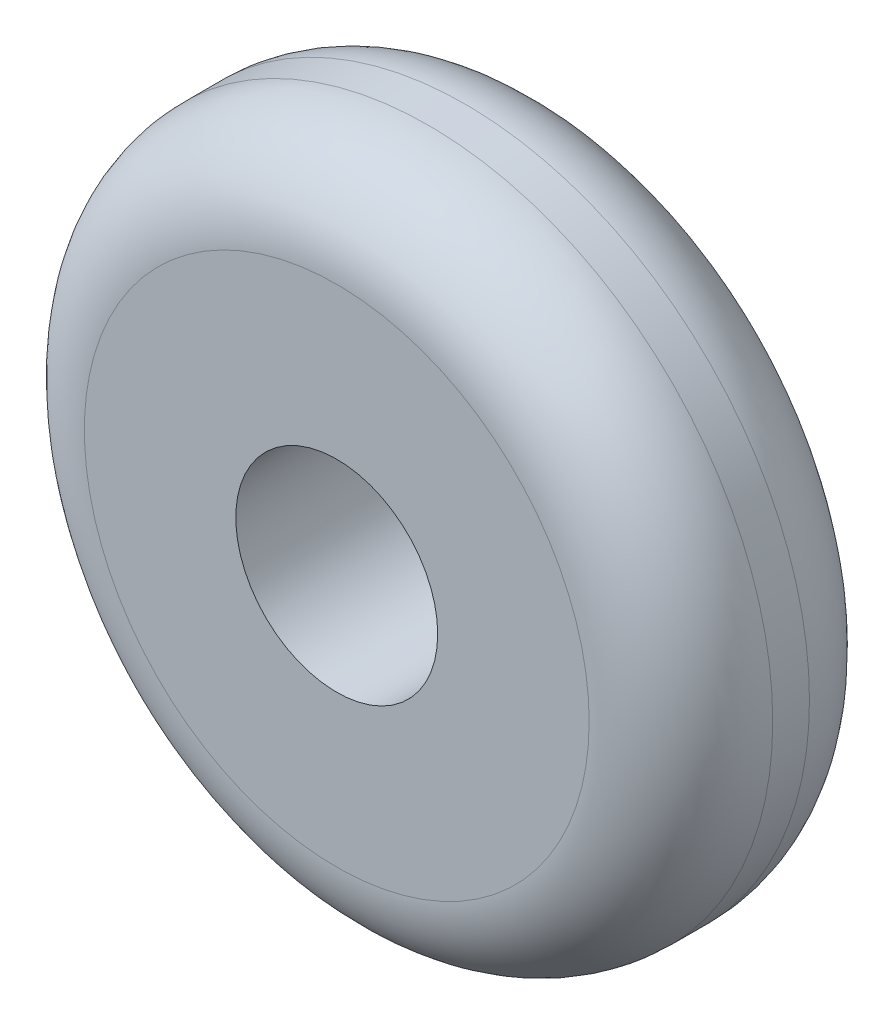
ISO-10303-21;
HEADER;
FILE_DESCRIPTION(('STEP AP214'),'2;1');
FILE_NAME('part.step','',(''),(''),'','','');
FILE_SCHEMA(('AUTOMOTIVE_DESIGN { 1 0 10303 214 1 1 1 1 }'));
ENDSEC;
DATA;
#1=APPLICATION_CONTEXT('core data for automotive mechanical design processes');
#2=APPLICATION_PROTOCOL_DEFINITION('international standard','automotive_design',2000,#1);
#3=PRODUCT_CONTEXT('',#1,'mechanical');
#4=PRODUCT('Part','Part','',(#3));
#5=PRODUCT_RELATED_PRODUCT_CATEGORY('part','',(#4));
#6=PRODUCT_DEFINITION_FORMATION('','',#4);
#7=PRODUCT_DEFINITION_CONTEXT('part definition',#1,'design');
#8=PRODUCT_DEFINITION('design','',#6,#7);
#9=PRODUCT_DEFINITION_SHAPE('','',#8);
#10=(LENGTH_UNIT() NAMED_UNIT(*) SI_UNIT(.MILLI.,.METRE.));
#11=(NAMED_UNIT(*) PLANE_ANGLE_UNIT() SI_UNIT($,.RADIAN.));
#12=(NAMED_UNIT(*) SI_UNIT($,.STERADIAN.) SOLID_ANGLE_UNIT());
#13=UNCERTAINTY_MEASURE_WITH_UNIT(LENGTH_MEASURE(1.E-05),#10,'distance_accuracy_value','');
#14=(GEOMETRIC_REPRESENTATION_CONTEXT(3) GLOBAL_UNCERTAINTY_ASSIGNED_CONTEXT((#13)) GLOBAL_UNIT_ASSIGNED_CONTEXT((#10,
#11,#12)) REPRESENTATION_CONTEXT('',''));
#15=CARTESIAN_POINT('',(0.,0.,0.));
#16=DIRECTION('',(0.,0.,1.));
#17=DIRECTION('',(1.,0.,0.));
#18=AXIS2_PLACEMENT_3D('',#15,#16,#17);
#19=CARTESIAN_POINT('',(0.,0.,24.));
#20=DIRECTION('',(0.,0.,1.));
#21=DIRECTION('',(1.,0.,0.));
#22=AXIS2_PLACEMENT_3D('',#19,#20,#21);
#23=PLANE('',#22);
#24=CARTESIAN_POINT('',(0.,0.,24.));
#25=DIRECTION('',(0.,0.,1.));
#26=DIRECTION('',(1.,0.,0.));
#27=AXIS2_PLACEMENT_3D('',#24,#25,#26);
#28=CIRCLE('',#27,27.5);
#29=CARTESIAN_POINT('',(27.5,0.,24.));
#30=VERTEX_POINT('',#29);
#31=EDGE_CURVE('E10',#30,#30,#28,.T.);
#32=ORIENTED_EDGE('',*,*,#31,.T.);
#33=EDGE_LOOP('',(#32));
#34=FACE_BOUND('',#33,.T.);
#35=CARTESIAN_POINT('',(0.,0.,24.));
#36=DIRECTION('',(0.,0.,1.));
#37=DIRECTION('',(1.,0.,0.));
#38=AXIS2_PLACEMENT_3D('',#35,#36,#37);
#39=CIRCLE('',#38,11.);
#40=CARTESIAN_POINT('',(11.,0.,24.));
#41=VERTEX_POINT('',#40);
#42=EDGE_CURVE('E55',#41,#41,#39,.T.);
#43=ORIENTED_EDGE('',*,*,#42,.F.);
#44=EDGE_LOOP('',(#43));
#45=FACE_BOUND('',#44,.T.);
#46=ADVANCED_FACE('F35',(#34,#45),#23,.T.);
#47=CARTESIAN_POINT('',(0.,0.,0.));
#48=DIRECTION('',(0.,0.,1.));
#49=DIRECTION('',(1.,0.,0.));
#50=AXIS2_PLACEMENT_3D('',#47,#48,#49);
#51=PLANE('',#50);
#52=CARTESIAN_POINT('',(0.,0.,0.));
#53=DIRECTION('',(0.,0.,1.));
#54=DIRECTION('',(1.,0.,0.));
#55=AXIS2_PLACEMENT_3D('',#52,#53,#54);
#56=CIRCLE('',#55,27.5);
#57=CARTESIAN_POINT('',(27.5,0.,0.));
#58=VERTEX_POINT('',#57);
#59=EDGE_CURVE('E42',#58,#58,#56,.F.);
#60=ORIENTED_EDGE('',*,*,#59,.T.);
#61=EDGE_LOOP('',(#60));
#62=FACE_BOUND('',#61,.T.);
#63=CARTESIAN_POINT('',(0.,0.,0.));
#64=DIRECTION('',(0.,0.,1.));
#65=DIRECTION('',(1.,0.,0.));
#66=AXIS2_PLACEMENT_3D('',#63,#64,#65);
#67=CIRCLE('',#66,11.);
#68=CARTESIAN_POINT('',(11.,0.,0.));
#69=VERTEX_POINT('',#68);
#70=EDGE_CURVE('E56',#69,#69,#67,.T.);
#71=ORIENTED_EDGE('',*,*,#70,.T.);
#72=EDGE_LOOP('',(#71));
#73=FACE_BOUND('',#72,.T.);
#74=ADVANCED_FACE('F66',(#62,#73),#51,.F.);
#75=CARTESIAN_POINT('',(0.,0.,24.));
#76=DIRECTION('',(0.,0.,-1.));
#77=DIRECTION('',(-1.,0.,0.));
#78=AXIS2_PLACEMENT_3D('',#75,#76,#77);
#79=CYLINDRICAL_SURFACE('',#78,37.5);
#80=CARTESIAN_POINT('',(0.,0.,10.));
#81=DIRECTION('',(0.,0.,1.));
#82=DIRECTION('',(1.,0.,0.));
#83=AXIS2_PLACEMENT_3D('',#80,#81,#82);
#84=CIRCLE('',#83,37.5);
#85=CARTESIAN_POINT('',(37.5,0.,10.));
#86=VERTEX_POINT('',#85);
#87=EDGE_CURVE('E46',#86,#86,#84,.T.);
#88=ORIENTED_EDGE('',*,*,#87,.T.);
#89=EDGE_LOOP('',(#88));
#90=FACE_BOUND('',#89,.T.);
#91=CARTESIAN_POINT('',(0.,0.,14.));
#92=DIRECTION('',(0.,0.,1.));
#93=DIRECTION('',(1.,0.,0.));
#94=AXIS2_PLACEMENT_3D('',#91,#92,#93);
#95=CIRCLE('',#94,37.5);
#96=CARTESIAN_POINT('',(37.5,0.,14.));
#97=VERTEX_POINT('',#96);
#98=EDGE_CURVE('E50',#97,#97,#95,.F.);
#99=ORIENTED_EDGE('',*,*,#98,.T.);
#100=EDGE_LOOP('',(#99));
#101=FACE_BOUND('',#100,.T.);
#102=ADVANCED_FACE('F71',(#90,#101),#79,.T.);
#103=CARTESIAN_POINT('',(0.,0.,24.));
#104=DIRECTION('',(0.,0.,-1.));
#105=DIRECTION('',(-1.,0.,0.));
#106=AXIS2_PLACEMENT_3D('',#103,#104,#105);
#107=CYLINDRICAL_SURFACE('',#106,11.);
#108=ORIENTED_EDGE('',*,*,#42,.T.);
#109=EDGE_LOOP('',(#108));
#110=FACE_BOUND('',#109,.T.);
#111=ORIENTED_EDGE('',*,*,#70,.F.);
#112=EDGE_LOOP('',(#111));
#113=FACE_BOUND('',#112,.T.);
#114=ADVANCED_FACE('F62',(#110,#113),#107,.F.);
#115=CARTESIAN_POINT('',(0.,0.,10.));
#116=DIRECTION('',(0.,0.,1.));
#117=DIRECTION('',(1.,0.,0.));
#118=AXIS2_PLACEMENT_3D('',#115,#116,#117);
#119=TOROIDAL_SURFACE('',#118,27.5,10.);
#120=ORIENTED_EDGE('',*,*,#59,.F.);
#121=EDGE_LOOP('',(#120));
#122=FACE_BOUND('',#121,.T.);
#123=ORIENTED_EDGE('',*,*,#87,.F.);
#124=EDGE_LOOP('',(#123));
#125=FACE_BOUND('',#124,.T.);
#126=ADVANCED_FACE('F77',(#122,#125),#119,.T.);
#127=CARTESIAN_POINT('',(0.,0.,14.));
#128=DIRECTION('',(0.,0.,1.));
#129=DIRECTION('',(1.,0.,0.));
#130=AXIS2_PLACEMENT_3D('',#127,#128,#129);
#131=TOROIDAL_SURFACE('',#130,27.5,10.);
#132=ORIENTED_EDGE('',*,*,#98,.F.);
#133=EDGE_LOOP('',(#132));
#134=FACE_BOUND('',#133,.T.);
#135=ORIENTED_EDGE('',*,*,#31,.F.);
#136=EDGE_LOOP('',(#135));
#137=FACE_BOUND('',#136,.T.);
#138=ADVANCED_FACE('F37',(#134,#137),#131,.T.);
#139=CLOSED_SHELL('',(#46,#74,#102,#114,#126,#138));
#140=MANIFOLD_SOLID_BREP('B2',#139);
#141=ADVANCED_BREP_SHAPE_REPRESENTATION('',(#18,#140),#14);
#142=SHAPE_DEFINITION_REPRESENTATION(#9,#141);
ENDSEC;
END-ISO-10303-21;
